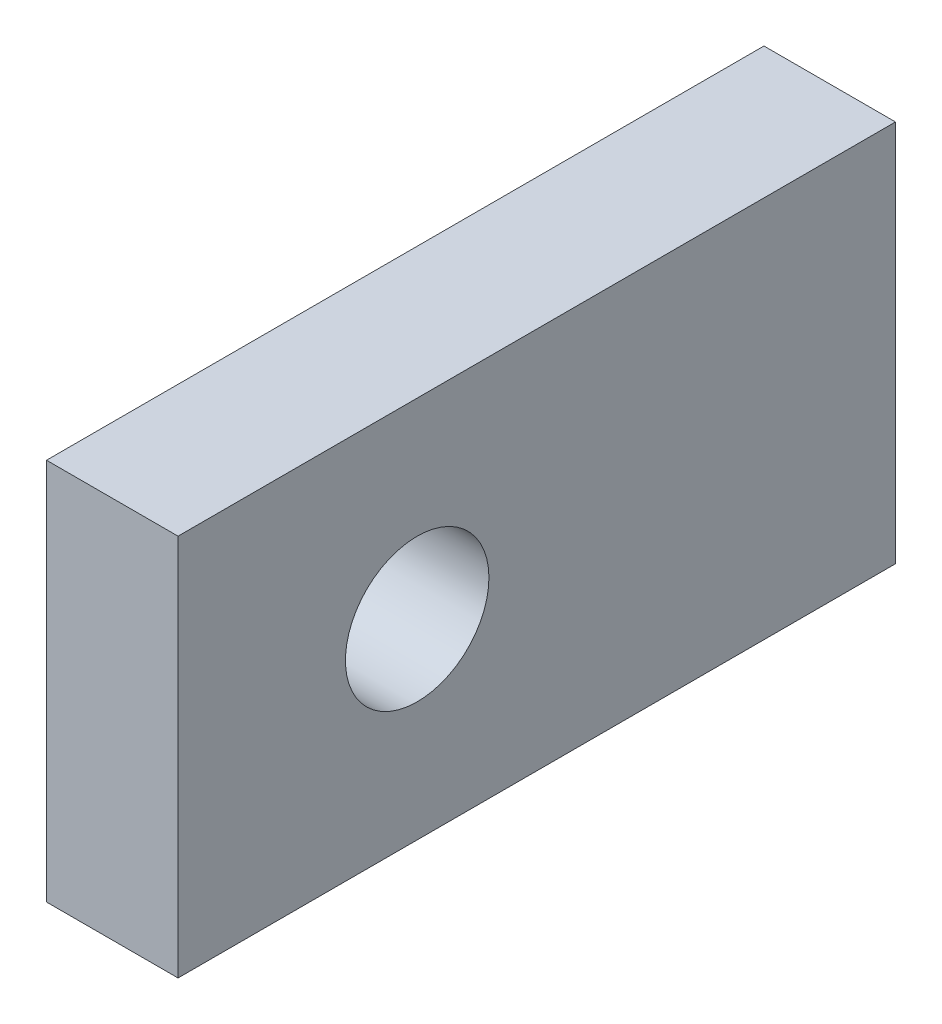
ISO-10303-21;
HEADER;
FILE_DESCRIPTION(('STEP AP214'),'2;1');
FILE_NAME('part.step','',(''),(''),'','','');
FILE_SCHEMA(('AUTOMOTIVE_DESIGN { 1 0 10303 214 1 1 1 1 }'));
ENDSEC;
DATA;
#1=APPLICATION_CONTEXT('core data for automotive mechanical design processes');
#2=APPLICATION_PROTOCOL_DEFINITION('international standard','automotive_design',2000,#1);
#3=PRODUCT_CONTEXT('',#1,'mechanical');
#4=PRODUCT('Part','Part','',(#3));
#5=PRODUCT_RELATED_PRODUCT_CATEGORY('part','',(#4));
#6=PRODUCT_DEFINITION_FORMATION('','',#4);
#7=PRODUCT_DEFINITION_CONTEXT('part definition',#1,'design');
#8=PRODUCT_DEFINITION('design','',#6,#7);
#9=PRODUCT_DEFINITION_SHAPE('','',#8);
#10=(LENGTH_UNIT() NAMED_UNIT(*) SI_UNIT(.MILLI.,.METRE.));
#11=(NAMED_UNIT(*) PLANE_ANGLE_UNIT() SI_UNIT($,.RADIAN.));
#12=(NAMED_UNIT(*) SI_UNIT($,.STERADIAN.) SOLID_ANGLE_UNIT());
#13=UNCERTAINTY_MEASURE_WITH_UNIT(LENGTH_MEASURE(1.E-05),#10,'distance_accuracy_value','');
#14=(GEOMETRIC_REPRESENTATION_CONTEXT(3) GLOBAL_UNCERTAINTY_ASSIGNED_CONTEXT((#13)) GLOBAL_UNIT_ASSIGNED_CONTEXT((#10,
#11,#12)) REPRESENTATION_CONTEXT('',''));
#15=CARTESIAN_POINT('',(0.,0.,0.));
#16=DIRECTION('',(0.,0.,1.));
#17=DIRECTION('',(1.,0.,0.));
#18=AXIS2_PLACEMENT_3D('',#15,#16,#17);
#19=CARTESIAN_POINT('',(3.25,-4.,7.5));
#20=DIRECTION('',(0.,0.,-1.));
#21=DIRECTION('',(-1.,0.,0.));
#22=AXIS2_PLACEMENT_3D('',#19,#20,#21);
#23=PLANE('',#22);
#24=DIRECTION('',(-1.,0.,0.));
#25=VECTOR('',#24,1.);
#26=CARTESIAN_POINT('',(3.25,4.,7.5));
#27=LINE('',#26,#25);
#28=CARTESIAN_POINT('',(3.25,4.,7.5));
#29=VERTEX_POINT('',#28);
#30=CARTESIAN_POINT('',(0.500000000000003,4.,7.5));
#31=VERTEX_POINT('',#30);
#32=EDGE_CURVE('E175',#29,#31,#27,.T.);
#33=ORIENTED_EDGE('',*,*,#32,.T.);
#34=DIRECTION('',(0.,-1.,0.));
#35=VECTOR('',#34,1.);
#36=CARTESIAN_POINT('',(0.500000000000002,-4.,7.5));
#37=LINE('',#36,#35);
#38=CARTESIAN_POINT('',(0.500000000000003,-4.,7.5));
#39=VERTEX_POINT('',#38);
#40=EDGE_CURVE('E11',#31,#39,#37,.T.);
#41=ORIENTED_EDGE('',*,*,#40,.T.);
#42=DIRECTION('',(-1.,0.,0.));
#43=VECTOR('',#42,1.);
#44=CARTESIAN_POINT('',(3.25,-4.,7.5));
#45=LINE('',#44,#43);
#46=CARTESIAN_POINT('',(3.25,-4.,7.5));
#47=VERTEX_POINT('',#46);
#48=EDGE_CURVE('E100',#47,#39,#45,.T.);
#49=ORIENTED_EDGE('',*,*,#48,.F.);
#50=DIRECTION('',(0.,-1.,0.));
#51=VECTOR('',#50,1.);
#52=CARTESIAN_POINT('',(3.25,-4.,7.5));
#53=LINE('',#52,#51);
#54=EDGE_CURVE('E107',#29,#47,#53,.T.);
#55=ORIENTED_EDGE('',*,*,#54,.F.);
#56=EDGE_LOOP('',(#33,#41,#49,#55));
#57=FACE_BOUND('',#56,.T.);
#58=ADVANCED_FACE('F38',(#57),#23,.F.);
#59=CARTESIAN_POINT('',(3.25,-4.,-7.5));
#60=DIRECTION('',(0.,1.,0.));
#61=DIRECTION('',(0.,0.,1.));
#62=AXIS2_PLACEMENT_3D('',#59,#60,#61);
#63=PLANE('',#62);
#64=ORIENTED_EDGE('',*,*,#48,.T.);
#65=DIRECTION('',(0.,0.,-1.));
#66=VECTOR('',#65,1.);
#67=CARTESIAN_POINT('',(0.500000000000002,-4.,-7.5));
#68=LINE('',#67,#66);
#69=CARTESIAN_POINT('',(0.500000000000003,-4.,-7.5));
#70=VERTEX_POINT('',#69);
#71=EDGE_CURVE('E119',#39,#70,#68,.T.);
#72=ORIENTED_EDGE('',*,*,#71,.T.);
#73=DIRECTION('',(-1.,0.,0.));
#74=VECTOR('',#73,1.);
#75=CARTESIAN_POINT('',(3.25,-4.,-7.5));
#76=LINE('',#75,#74);
#77=CARTESIAN_POINT('',(3.25,-4.,-7.5));
#78=VERTEX_POINT('',#77);
#79=EDGE_CURVE('E102',#78,#70,#76,.T.);
#80=ORIENTED_EDGE('',*,*,#79,.F.);
#81=DIRECTION('',(0.,0.,-1.));
#82=VECTOR('',#81,1.);
#83=CARTESIAN_POINT('',(3.25,-4.,-7.5));
#84=LINE('',#83,#82);
#85=EDGE_CURVE('E95',#47,#78,#84,.T.);
#86=ORIENTED_EDGE('',*,*,#85,.F.);
#87=EDGE_LOOP('',(#64,#72,#80,#86));
#88=FACE_BOUND('',#87,.T.);
#89=ADVANCED_FACE('F97',(#88),#63,.F.);
#90=CARTESIAN_POINT('',(3.25,-4.,-7.5));
#91=DIRECTION('',(0.,0.,1.));
#92=DIRECTION('',(1.,0.,0.));
#93=AXIS2_PLACEMENT_3D('',#90,#91,#92);
#94=PLANE('',#93);
#95=ORIENTED_EDGE('',*,*,#79,.T.);
#96=DIRECTION('',(0.,1.,0.));
#97=VECTOR('',#96,1.);
#98=CARTESIAN_POINT('',(0.500000000000002,-4.,-7.5));
#99=LINE('',#98,#97);
#100=CARTESIAN_POINT('',(0.500000000000003,4.,-7.5));
#101=VERTEX_POINT('',#100);
#102=EDGE_CURVE('E63',#70,#101,#99,.T.);
#103=ORIENTED_EDGE('',*,*,#102,.T.);
#104=DIRECTION('',(-1.,0.,0.));
#105=VECTOR('',#104,1.);
#106=CARTESIAN_POINT('',(3.25,4.,-7.5));
#107=LINE('',#106,#105);
#108=CARTESIAN_POINT('',(3.25,4.,-7.5));
#109=VERTEX_POINT('',#108);
#110=EDGE_CURVE('E125',#109,#101,#107,.T.);
#111=ORIENTED_EDGE('',*,*,#110,.F.);
#112=DIRECTION('',(0.,1.,0.));
#113=VECTOR('',#112,1.);
#114=CARTESIAN_POINT('',(3.25,-4.,-7.5));
#115=LINE('',#114,#113);
#116=EDGE_CURVE('E106',#78,#109,#115,.T.);
#117=ORIENTED_EDGE('',*,*,#116,.F.);
#118=EDGE_LOOP('',(#95,#103,#111,#117));
#119=FACE_BOUND('',#118,.T.);
#120=ADVANCED_FACE('F187',(#119),#94,.F.);
#121=CARTESIAN_POINT('',(3.25,4.,-7.5));
#122=DIRECTION('',(0.,-1.,0.));
#123=DIRECTION('',(0.,0.,-1.));
#124=AXIS2_PLACEMENT_3D('',#121,#122,#123);
#125=PLANE('',#124);
#126=ORIENTED_EDGE('',*,*,#110,.T.);
#127=DIRECTION('',(0.,0.,1.));
#128=VECTOR('',#127,1.);
#129=CARTESIAN_POINT('',(0.500000000000002,4.,-7.5));
#130=LINE('',#129,#128);
#131=EDGE_CURVE('E48',#101,#31,#130,.T.);
#132=ORIENTED_EDGE('',*,*,#131,.T.);
#133=ORIENTED_EDGE('',*,*,#32,.F.);
#134=DIRECTION('',(0.,0.,1.));
#135=VECTOR('',#134,1.);
#136=CARTESIAN_POINT('',(3.25,4.,-7.5));
#137=LINE('',#136,#135);
#138=EDGE_CURVE('E112',#109,#29,#137,.T.);
#139=ORIENTED_EDGE('',*,*,#138,.F.);
#140=EDGE_LOOP('',(#126,#132,#133,#139));
#141=FACE_BOUND('',#140,.T.);
#142=ADVANCED_FACE('F178',(#141),#125,.F.);
#143=CARTESIAN_POINT('',(3.25,0.,0.));
#144=DIRECTION('',(1.,0.,0.));
#145=DIRECTION('',(0.,0.,-1.));
#146=AXIS2_PLACEMENT_3D('',#143,#144,#145);
#147=PLANE('',#146);
#148=CARTESIAN_POINT('',(3.25,0.,2.5));
#149=DIRECTION('',(1.,0.,0.));
#150=DIRECTION('',(0.,0.,-1.));
#151=AXIS2_PLACEMENT_3D('',#148,#149,#150);
#152=CIRCLE('',#151,1.5);
#153=CARTESIAN_POINT('',(3.25,0.,1.));
#154=VERTEX_POINT('',#153);
#155=EDGE_CURVE('E158',#154,#154,#152,.T.);
#156=ORIENTED_EDGE('',*,*,#155,.F.);
#157=EDGE_LOOP('',(#156));
#158=FACE_BOUND('',#157,.T.);
#159=ORIENTED_EDGE('',*,*,#54,.T.);
#160=ORIENTED_EDGE('',*,*,#85,.T.);
#161=ORIENTED_EDGE('',*,*,#116,.T.);
#162=ORIENTED_EDGE('',*,*,#138,.T.);
#163=EDGE_LOOP('',(#159,#160,#161,#162));
#164=FACE_BOUND('',#163,.T.);
#165=ADVANCED_FACE('F110',(#158,#164),#147,.T.);
#166=CARTESIAN_POINT('',(0.,0.,0.));
#167=DIRECTION('',(1.,0.,0.));
#168=DIRECTION('',(0.,0.,-1.));
#169=AXIS2_PLACEMENT_3D('',#166,#167,#168);
#170=PLANE('',#169);
#171=DIRECTION('',(0.,-1.,0.));
#172=VECTOR('',#171,1.);
#173=CARTESIAN_POINT('',(0.,0.,-6.99999999999999));
#174=LINE('',#173,#172);
#175=CARTESIAN_POINT('',(0.,3.5,-6.99999999999999));
#176=VERTEX_POINT('',#175);
#177=CARTESIAN_POINT('',(0.,-3.5,-6.99999999999999));
#178=VERTEX_POINT('',#177);
#179=EDGE_CURVE('E134',#176,#178,#174,.T.);
#180=ORIENTED_EDGE('',*,*,#179,.T.);
#181=DIRECTION('',(0.,0.,1.));
#182=VECTOR('',#181,1.);
#183=CARTESIAN_POINT('',(0.,-3.5,0.));
#184=LINE('',#183,#182);
#185=CARTESIAN_POINT('',(0.,-3.5,7.));
#186=VERTEX_POINT('',#185);
#187=EDGE_CURVE('E137',#178,#186,#184,.T.);
#188=ORIENTED_EDGE('',*,*,#187,.T.);
#189=DIRECTION('',(0.,1.,0.));
#190=VECTOR('',#189,1.);
#191=CARTESIAN_POINT('',(0.,0.,7.));
#192=LINE('',#191,#190);
#193=CARTESIAN_POINT('',(0.,3.5,7.));
#194=VERTEX_POINT('',#193);
#195=EDGE_CURVE('E123',#186,#194,#192,.T.);
#196=ORIENTED_EDGE('',*,*,#195,.T.);
#197=DIRECTION('',(0.,0.,-1.));
#198=VECTOR('',#197,1.);
#199=CARTESIAN_POINT('',(0.,3.5,0.));
#200=LINE('',#199,#198);
#201=EDGE_CURVE('E131',#194,#176,#200,.T.);
#202=ORIENTED_EDGE('',*,*,#201,.T.);
#203=EDGE_LOOP('',(#180,#188,#196,#202));
#204=FACE_BOUND('',#203,.T.);
#205=CARTESIAN_POINT('',(0.,0.,2.5));
#206=DIRECTION('',(1.,0.,0.));
#207=DIRECTION('',(0.,0.,-1.));
#208=AXIS2_PLACEMENT_3D('',#205,#206,#207);
#209=CIRCLE('',#208,1.5);
#210=CARTESIAN_POINT('',(0.,0.,1.));
#211=VERTEX_POINT('',#210);
#212=EDGE_CURVE('E115',#211,#211,#209,.T.);
#213=ORIENTED_EDGE('',*,*,#212,.T.);
#214=EDGE_LOOP('',(#213));
#215=FACE_BOUND('',#214,.T.);
#216=ADVANCED_FACE('F214',(#204,#215),#170,.F.);
#217=CARTESIAN_POINT('',(0.,0.,2.5));
#218=DIRECTION('',(1.,0.,0.));
#219=DIRECTION('',(0.,0.,-1.));
#220=AXIS2_PLACEMENT_3D('',#217,#218,#219);
#221=CYLINDRICAL_SURFACE('',#220,1.5);
#222=CARTESIAN_POINT('',(0.,0.,1.));
#223=CARTESIAN_POINT('',(0.0338541666666666,0.,1.));
#224=CARTESIAN_POINT('',(0.0677083333333333,0.,1.));
#225=CARTESIAN_POINT('',(0.135416666666667,0.,1.));
#226=CARTESIAN_POINT('',(0.169270833333333,0.,1.));
#227=CARTESIAN_POINT('',(0.236979166666667,0.,1.));
#228=CARTESIAN_POINT('',(0.270833333333333,0.,1.));
#229=CARTESIAN_POINT('',(0.338541666666667,0.,1.));
#230=CARTESIAN_POINT('',(0.372395833333333,0.,1.));
#231=CARTESIAN_POINT('',(0.440104166666667,0.,1.));
#232=CARTESIAN_POINT('',(0.473958333333333,0.,1.));
#233=CARTESIAN_POINT('',(0.541666666666667,0.,1.));
#234=CARTESIAN_POINT('',(0.575520833333333,0.,1.));
#235=CARTESIAN_POINT('',(0.643229166666667,0.,1.));
#236=CARTESIAN_POINT('',(0.677083333333333,0.,1.));
#237=CARTESIAN_POINT('',(0.744791666666667,0.,1.));
#238=CARTESIAN_POINT('',(0.778645833333333,0.,1.));
#239=CARTESIAN_POINT('',(0.846354166666667,0.,1.));
#240=CARTESIAN_POINT('',(0.880208333333333,0.,1.));
#241=CARTESIAN_POINT('',(0.947916666666667,0.,1.));
#242=CARTESIAN_POINT('',(0.981770833333333,0.,1.));
#243=CARTESIAN_POINT('',(1.04947916666667,0.,1.));
#244=CARTESIAN_POINT('',(1.08333333333333,0.,1.));
#245=CARTESIAN_POINT('',(1.15104166666667,0.,1.));
#246=CARTESIAN_POINT('',(1.18489583333333,0.,1.));
#247=CARTESIAN_POINT('',(1.25260416666667,0.,1.));
#248=CARTESIAN_POINT('',(1.28645833333333,0.,1.));
#249=CARTESIAN_POINT('',(1.35416666666667,0.,1.));
#250=CARTESIAN_POINT('',(1.38802083333333,0.,1.));
#251=CARTESIAN_POINT('',(1.45572916666667,0.,1.));
#252=CARTESIAN_POINT('',(1.48958333333333,0.,1.));
#253=CARTESIAN_POINT('',(1.55729166666667,0.,1.));
#254=CARTESIAN_POINT('',(1.59114583333333,0.,1.));
#255=CARTESIAN_POINT('',(1.65885416666667,0.,1.));
#256=CARTESIAN_POINT('',(1.69270833333333,0.,1.));
#257=CARTESIAN_POINT('',(1.76041666666667,0.,1.));
#258=CARTESIAN_POINT('',(1.79427083333333,0.,1.));
#259=CARTESIAN_POINT('',(1.86197916666667,0.,1.));
#260=CARTESIAN_POINT('',(1.89583333333333,0.,1.));
#261=CARTESIAN_POINT('',(1.96354166666667,0.,1.));
#262=CARTESIAN_POINT('',(1.99739583333333,0.,1.));
#263=CARTESIAN_POINT('',(2.06510416666667,0.,1.));
#264=CARTESIAN_POINT('',(2.09895833333333,0.,1.));
#265=CARTESIAN_POINT('',(2.16666666666667,0.,1.));
#266=CARTESIAN_POINT('',(2.20052083333333,0.,1.));
#267=CARTESIAN_POINT('',(2.26822916666667,0.,1.));
#268=CARTESIAN_POINT('',(2.30208333333333,0.,1.));
#269=CARTESIAN_POINT('',(2.36979166666667,0.,1.));
#270=CARTESIAN_POINT('',(2.40364583333333,0.,1.));
#271=CARTESIAN_POINT('',(2.47135416666667,0.,1.));
#272=CARTESIAN_POINT('',(2.50520833333333,0.,1.));
#273=CARTESIAN_POINT('',(2.57291666666667,0.,1.));
#274=CARTESIAN_POINT('',(2.60677083333333,0.,1.));
#275=CARTESIAN_POINT('',(2.67447916666667,0.,1.));
#276=CARTESIAN_POINT('',(2.70833333333333,0.,1.));
#277=CARTESIAN_POINT('',(2.77604166666667,0.,1.));
#278=CARTESIAN_POINT('',(2.80989583333333,0.,1.));
#279=CARTESIAN_POINT('',(2.87760416666667,0.,1.));
#280=CARTESIAN_POINT('',(2.91145833333333,0.,1.));
#281=CARTESIAN_POINT('',(2.97916666666667,0.,1.));
#282=CARTESIAN_POINT('',(3.01302083333333,0.,1.));
#283=CARTESIAN_POINT('',(3.08072916666667,0.,1.));
#284=CARTESIAN_POINT('',(3.11458333333333,0.,1.));
#285=CARTESIAN_POINT('',(3.18229166666667,0.,1.));
#286=CARTESIAN_POINT('',(3.21614583333333,0.,1.));
#287=CARTESIAN_POINT('',(3.25,0.,1.));
#288=B_SPLINE_CURVE_WITH_KNOTS('',3,(#222,#223,#224,#225,#226,#227,#228,#229,#230,#231,#232,
#233,#234,#235,#236,#237,#238,#239,#240,#241,#242,#243,#244,#245,#246,#247,#248,#249,#250,#251,
#252,#253,#254,#255,#256,#257,#258,#259,#260,#261,#262,#263,#264,#265,#266,#267,#268,#269,#270,
#271,#272,#273,#274,#275,#276,#277,#278,#279,#280,#281,#282,#283,#284,#285,#286,#287),
.UNSPECIFIED.,.F.,.F.,(4,2,2,2,2,2,2,2,2,2,2,2,2,2,2,2,2,2,2,2,2,2,2,2,2,2,2,2,2,2,2,2,4),(0.,
0.1015625,0.203125,0.3046875,0.40625,0.5078125,0.609375,0.7109375,0.8125,0.9140625,1.015625,
1.1171875,1.21875,1.3203125,1.421875,1.5234375,1.625,1.7265625,1.828125,1.9296875,2.03125,
2.1328125,2.234375,2.3359375,2.4375,2.5390625,2.640625,2.7421875,2.84375,2.9453125,3.046875,
3.1484375,3.25),.UNSPECIFIED.);
#289=EDGE_CURVE('BSEAM210',#211,#154,#288,.T.);
#290=ORIENTED_EDGE('',*,*,#212,.F.);
#291=ORIENTED_EDGE('',*,*,#155,.T.);
#292=ORIENTED_EDGE('',*,*,#289,.T.);
#293=ORIENTED_EDGE('',*,*,#289,.F.);
#294=EDGE_LOOP('',(#290,#292,#291,#293));
#295=FACE_BOUND('',#294,.T.);
#296=ADVANCED_FACE('F210',(#295),#221,.F.);
#297=CARTESIAN_POINT('',(0.500000000000002,4.,-7.5));
#298=DIRECTION('',(0.707106781186549,-0.707106781186546,0.));
#299=DIRECTION('',(0.,0.,1.));
#300=AXIS2_PLACEMENT_3D('',#297,#298,#299);
#301=PLANE('',#300);
#302=DIRECTION('',(-0.577350269189624,-0.577350269189626,0.577350269189626));
#303=VECTOR('',#302,1.);
#304=CARTESIAN_POINT('',(0.500000000000002,4.,-7.5));
#305=LINE('',#304,#303);
#306=EDGE_CURVE('E150',#176,#101,#305,.F.);
#307=ORIENTED_EDGE('',*,*,#306,.F.);
#308=ORIENTED_EDGE('',*,*,#201,.F.);
#309=DIRECTION('',(-0.577350269189625,-0.577350269189626,-0.577350269189627));
#310=VECTOR('',#309,1.);
#311=CARTESIAN_POINT('',(-2.16666666666666,1.33333333333333,4.83333333333333));
#312=LINE('',#311,#310);
#313=EDGE_CURVE('E42',#31,#194,#312,.T.);
#314=ORIENTED_EDGE('',*,*,#313,.F.);
#315=ORIENTED_EDGE('',*,*,#131,.F.);
#316=EDGE_LOOP('',(#307,#308,#314,#315));
#317=FACE_BOUND('',#316,.T.);
#318=ADVANCED_FACE('F40',(#317),#301,.F.);
#319=CARTESIAN_POINT('',(0.500000000000002,-4.,7.5));
#320=DIRECTION('',(0.707106781186549,0.,-0.707106781186546));
#321=DIRECTION('',(0.,-1.,0.));
#322=AXIS2_PLACEMENT_3D('',#319,#320,#321);
#323=PLANE('',#322);
#324=ORIENTED_EDGE('',*,*,#313,.T.);
#325=ORIENTED_EDGE('',*,*,#195,.F.);
#326=DIRECTION('',(0.577350269189624,-0.577350269189626,0.577350269189626));
#327=VECTOR('',#326,1.);
#328=CARTESIAN_POINT('',(0.500000000000002,-4.,7.5));
#329=LINE('',#328,#327);
#330=EDGE_CURVE('E148',#39,#186,#329,.F.);
#331=ORIENTED_EDGE('',*,*,#330,.F.);
#332=ORIENTED_EDGE('',*,*,#40,.F.);
#333=EDGE_LOOP('',(#324,#325,#331,#332));
#334=FACE_BOUND('',#333,.T.);
#335=ADVANCED_FACE('F181',(#334),#323,.F.);
#336=CARTESIAN_POINT('',(0.500000000000002,-4.,-7.5));
#337=DIRECTION('',(0.707106781186549,0.,0.707106781186546));
#338=DIRECTION('',(0.,1.,0.));
#339=AXIS2_PLACEMENT_3D('',#336,#337,#338);
#340=PLANE('',#339);
#341=ORIENTED_EDGE('',*,*,#306,.T.);
#342=ORIENTED_EDGE('',*,*,#102,.F.);
#343=DIRECTION('',(-0.577350269189625,0.577350269189626,0.577350269189627));
#344=VECTOR('',#343,1.);
#345=CARTESIAN_POINT('',(0.500000000000002,-4.,-7.5));
#346=LINE('',#345,#344);
#347=EDGE_CURVE('E145',#178,#70,#346,.F.);
#348=ORIENTED_EDGE('',*,*,#347,.F.);
#349=ORIENTED_EDGE('',*,*,#179,.F.);
#350=EDGE_LOOP('',(#341,#342,#348,#349));
#351=FACE_BOUND('',#350,.T.);
#352=ADVANCED_FACE('F204',(#351),#340,.F.);
#353=CARTESIAN_POINT('',(0.500000000000002,-4.,-7.5));
#354=DIRECTION('',(0.707106781186549,0.707106781186546,0.));
#355=DIRECTION('',(0.,0.,-1.));
#356=AXIS2_PLACEMENT_3D('',#353,#354,#355);
#357=PLANE('',#356);
#358=ORIENTED_EDGE('',*,*,#330,.T.);
#359=ORIENTED_EDGE('',*,*,#187,.F.);
#360=ORIENTED_EDGE('',*,*,#347,.T.);
#361=ORIENTED_EDGE('',*,*,#71,.F.);
#362=EDGE_LOOP('',(#358,#359,#360,#361));
#363=FACE_BOUND('',#362,.T.);
#364=ADVANCED_FACE('F185',(#363),#357,.F.);
#365=CLOSED_SHELL('',(#58,#89,#120,#142,#165,#216,#296,#318,#335,#352,#364));
#366=MANIFOLD_SOLID_BREP('B2',#365);
#367=ADVANCED_BREP_SHAPE_REPRESENTATION('',(#18,#366),#14);
#368=SHAPE_DEFINITION_REPRESENTATION(#9,#367);
ENDSEC;
END-ISO-10303-21;
